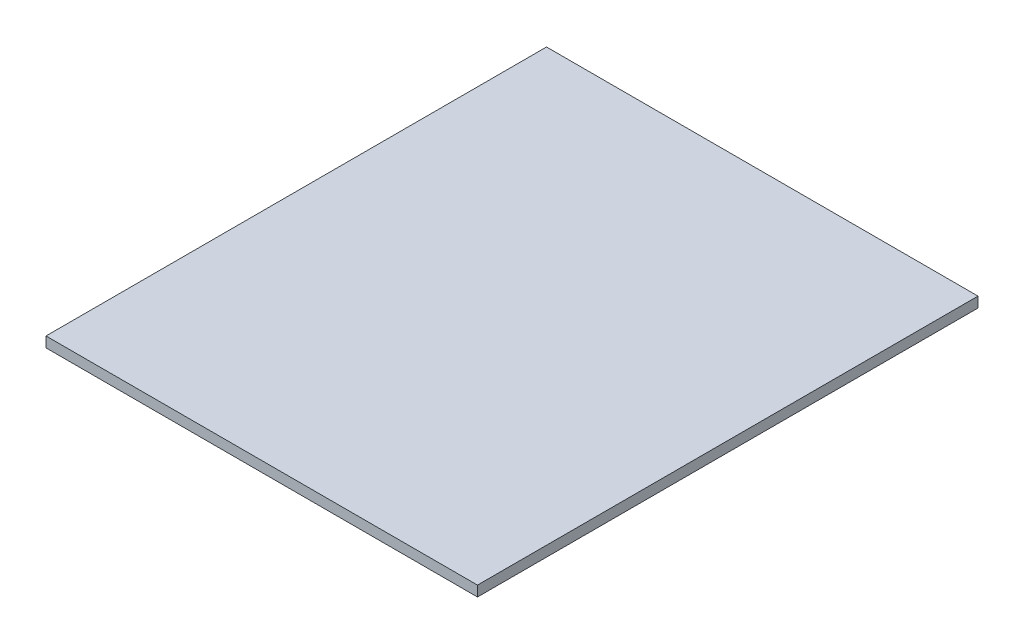
ISO-10303-21;
HEADER;
FILE_DESCRIPTION(('STEP AP214'),'2;1');
FILE_NAME('part.step','',(''),(''),'','','');
FILE_SCHEMA(('AUTOMOTIVE_DESIGN { 1 0 10303 214 1 1 1 1 }'));
ENDSEC;
DATA;
#1=APPLICATION_CONTEXT('core data for automotive mechanical design processes');
#2=APPLICATION_PROTOCOL_DEFINITION('international standard','automotive_design',2000,#1);
#3=PRODUCT_CONTEXT('',#1,'mechanical');
#4=PRODUCT('Part','Part','',(#3));
#5=PRODUCT_RELATED_PRODUCT_CATEGORY('part','',(#4));
#6=PRODUCT_DEFINITION_FORMATION('','',#4);
#7=PRODUCT_DEFINITION_CONTEXT('part definition',#1,'design');
#8=PRODUCT_DEFINITION('design','',#6,#7);
#9=PRODUCT_DEFINITION_SHAPE('','',#8);
#10=(LENGTH_UNIT() NAMED_UNIT(*) SI_UNIT(.MILLI.,.METRE.));
#11=(NAMED_UNIT(*) PLANE_ANGLE_UNIT() SI_UNIT($,.RADIAN.));
#12=(NAMED_UNIT(*) SI_UNIT($,.STERADIAN.) SOLID_ANGLE_UNIT());
#13=UNCERTAINTY_MEASURE_WITH_UNIT(LENGTH_MEASURE(1.E-05),#10,'distance_accuracy_value','');
#14=(GEOMETRIC_REPRESENTATION_CONTEXT(3) GLOBAL_UNCERTAINTY_ASSIGNED_CONTEXT((#13)) GLOBAL_UNIT_ASSIGNED_CONTEXT((#10,
#11,#12)) REPRESENTATION_CONTEXT('',''));
#15=CARTESIAN_POINT('',(0.,0.,0.));
#16=DIRECTION('',(0.,0.,1.));
#17=DIRECTION('',(1.,0.,0.));
#18=AXIS2_PLACEMENT_3D('',#15,#16,#17);
#19=CARTESIAN_POINT('',(0.,6.,0.));
#20=DIRECTION('',(0.,0.,-1.));
#21=DIRECTION('',(-1.,0.,0.));
#22=AXIS2_PLACEMENT_3D('',#19,#20,#21);
#23=PLANE('',#22);
#24=DIRECTION('',(1.,0.,0.));
#25=VECTOR('',#24,1.);
#26=CARTESIAN_POINT('',(0.,0.,0.));
#27=LINE('',#26,#25);
#28=CARTESIAN_POINT('',(-12.,0.,0.));
#29=VERTEX_POINT('',#28);
#30=CARTESIAN_POINT('',(238.,0.,0.));
#31=VERTEX_POINT('',#30);
#32=EDGE_CURVE('E90',#29,#31,#27,.T.);
#33=ORIENTED_EDGE('',*,*,#32,.T.);
#34=DIRECTION('',(0.,-1.,0.));
#35=VECTOR('',#34,1.);
#36=CARTESIAN_POINT('',(238.,6.,0.));
#37=LINE('',#36,#35);
#38=CARTESIAN_POINT('',(238.,6.,0.));
#39=VERTEX_POINT('',#38);
#40=EDGE_CURVE('E11',#39,#31,#37,.T.);
#41=ORIENTED_EDGE('',*,*,#40,.F.);
#42=DIRECTION('',(1.,0.,0.));
#43=VECTOR('',#42,1.);
#44=CARTESIAN_POINT('',(0.,6.,0.));
#45=LINE('',#44,#43);
#46=CARTESIAN_POINT('',(-12.,6.,0.));
#47=VERTEX_POINT('',#46);
#48=EDGE_CURVE('E60',#47,#39,#45,.T.);
#49=ORIENTED_EDGE('',*,*,#48,.F.);
#50=DIRECTION('',(0.,1.,0.));
#51=VECTOR('',#50,1.);
#52=CARTESIAN_POINT('',(-12.,6.,0.));
#53=LINE('',#52,#51);
#54=EDGE_CURVE('E113',#29,#47,#53,.T.);
#55=ORIENTED_EDGE('',*,*,#54,.F.);
#56=EDGE_LOOP('',(#33,#41,#49,#55));
#57=FACE_BOUND('',#56,.T.);
#58=ADVANCED_FACE('F45',(#57),#23,.F.);
#59=CARTESIAN_POINT('',(238.,6.,0.));
#60=DIRECTION('',(-1.,0.,0.));
#61=DIRECTION('',(0.,0.,1.));
#62=AXIS2_PLACEMENT_3D('',#59,#60,#61);
#63=PLANE('',#62);
#64=DIRECTION('',(0.,0.,-1.));
#65=VECTOR('',#64,1.);
#66=CARTESIAN_POINT('',(238.,0.,0.));
#67=LINE('',#66,#65);
#68=CARTESIAN_POINT('',(238.,0.,-290.));
#69=VERTEX_POINT('',#68);
#70=EDGE_CURVE('E82',#31,#69,#67,.T.);
#71=ORIENTED_EDGE('',*,*,#70,.T.);
#72=DIRECTION('',(0.,-1.,0.));
#73=VECTOR('',#72,1.);
#74=CARTESIAN_POINT('',(238.,6.,-290.));
#75=LINE('',#74,#73);
#76=CARTESIAN_POINT('',(238.,6.,-290.));
#77=VERTEX_POINT('',#76);
#78=EDGE_CURVE('E87',#77,#69,#75,.T.);
#79=ORIENTED_EDGE('',*,*,#78,.F.);
#80=DIRECTION('',(0.,0.,-1.));
#81=VECTOR('',#80,1.);
#82=CARTESIAN_POINT('',(238.,6.,0.));
#83=LINE('',#82,#81);
#84=EDGE_CURVE('E54',#39,#77,#83,.T.);
#85=ORIENTED_EDGE('',*,*,#84,.F.);
#86=ORIENTED_EDGE('',*,*,#40,.T.);
#87=EDGE_LOOP('',(#71,#79,#85,#86));
#88=FACE_BOUND('',#87,.T.);
#89=ADVANCED_FACE('F84',(#88),#63,.F.);
#90=CARTESIAN_POINT('',(0.,6.,0.));
#91=DIRECTION('',(0.,-1.,0.));
#92=DIRECTION('',(0.,0.,-1.));
#93=AXIS2_PLACEMENT_3D('',#90,#91,#92);
#94=PLANE('',#93);
#95=ORIENTED_EDGE('',*,*,#84,.T.);
#96=DIRECTION('',(1.,0.,0.));
#97=VECTOR('',#96,1.);
#98=CARTESIAN_POINT('',(238.,6.,-290.));
#99=LINE('',#98,#97);
#100=CARTESIAN_POINT('',(-12.,6.,-290.));
#101=VERTEX_POINT('',#100);
#102=EDGE_CURVE('E105',#101,#77,#99,.T.);
#103=ORIENTED_EDGE('',*,*,#102,.F.);
#104=DIRECTION('',(0.,0.,-1.));
#105=VECTOR('',#104,1.);
#106=CARTESIAN_POINT('',(-12.,6.,0.));
#107=LINE('',#106,#105);
#108=EDGE_CURVE('E117',#47,#101,#107,.T.);
#109=ORIENTED_EDGE('',*,*,#108,.F.);
#110=ORIENTED_EDGE('',*,*,#48,.T.);
#111=EDGE_LOOP('',(#95,#103,#109,#110));
#112=FACE_BOUND('',#111,.T.);
#113=ADVANCED_FACE('F131',(#112),#94,.F.);
#114=CARTESIAN_POINT('',(0.,0.,0.));
#115=DIRECTION('',(0.,-1.,0.));
#116=DIRECTION('',(0.,0.,-1.));
#117=AXIS2_PLACEMENT_3D('',#114,#115,#116);
#118=PLANE('',#117);
#119=ORIENTED_EDGE('',*,*,#32,.F.);
#120=DIRECTION('',(0.,0.,1.));
#121=VECTOR('',#120,1.);
#122=CARTESIAN_POINT('',(-12.,0.,0.));
#123=LINE('',#122,#121);
#124=CARTESIAN_POINT('',(-12.,0.,-290.));
#125=VERTEX_POINT('',#124);
#126=EDGE_CURVE('E95',#125,#29,#123,.T.);
#127=ORIENTED_EDGE('',*,*,#126,.F.);
#128=DIRECTION('',(-1.,0.,0.));
#129=VECTOR('',#128,1.);
#130=CARTESIAN_POINT('',(238.,0.,-290.));
#131=LINE('',#130,#129);
#132=EDGE_CURVE('E92',#69,#125,#131,.T.);
#133=ORIENTED_EDGE('',*,*,#132,.F.);
#134=ORIENTED_EDGE('',*,*,#70,.F.);
#135=EDGE_LOOP('',(#119,#127,#133,#134));
#136=FACE_BOUND('',#135,.T.);
#137=ADVANCED_FACE('F93',(#136),#118,.T.);
#138=CARTESIAN_POINT('',(-12.,0.,0.));
#139=DIRECTION('',(1.,0.,0.));
#140=DIRECTION('',(0.,0.,-1.));
#141=AXIS2_PLACEMENT_3D('',#138,#139,#140);
#142=PLANE('',#141);
#143=ORIENTED_EDGE('',*,*,#54,.T.);
#144=ORIENTED_EDGE('',*,*,#108,.T.);
#145=DIRECTION('',(0.,1.,0.));
#146=VECTOR('',#145,1.);
#147=CARTESIAN_POINT('',(-12.,6.,-290.));
#148=LINE('',#147,#146);
#149=EDGE_CURVE('E100',#125,#101,#148,.T.);
#150=ORIENTED_EDGE('',*,*,#149,.F.);
#151=ORIENTED_EDGE('',*,*,#126,.T.);
#152=EDGE_LOOP('',(#143,#144,#150,#151));
#153=FACE_BOUND('',#152,.T.);
#154=ADVANCED_FACE('F130',(#153),#142,.F.);
#155=CARTESIAN_POINT('',(0.,0.,-290.));
#156=DIRECTION('',(0.,0.,-1.));
#157=DIRECTION('',(-1.,0.,0.));
#158=AXIS2_PLACEMENT_3D('',#155,#156,#157);
#159=PLANE('',#158);
#160=ORIENTED_EDGE('',*,*,#78,.T.);
#161=ORIENTED_EDGE('',*,*,#132,.T.);
#162=ORIENTED_EDGE('',*,*,#149,.T.);
#163=ORIENTED_EDGE('',*,*,#102,.T.);
#164=EDGE_LOOP('',(#160,#161,#162,#163));
#165=FACE_BOUND('',#164,.T.);
#166=ADVANCED_FACE('F103',(#165),#159,.T.);
#167=CLOSED_SHELL('',(#58,#89,#113,#137,#154,#166));
#168=MANIFOLD_SOLID_BREP('B2',#167);
#169=ADVANCED_BREP_SHAPE_REPRESENTATION('',(#18,#168),#14);
#170=SHAPE_DEFINITION_REPRESENTATION(#9,#169);
ENDSEC;
END-ISO-10303-21;
